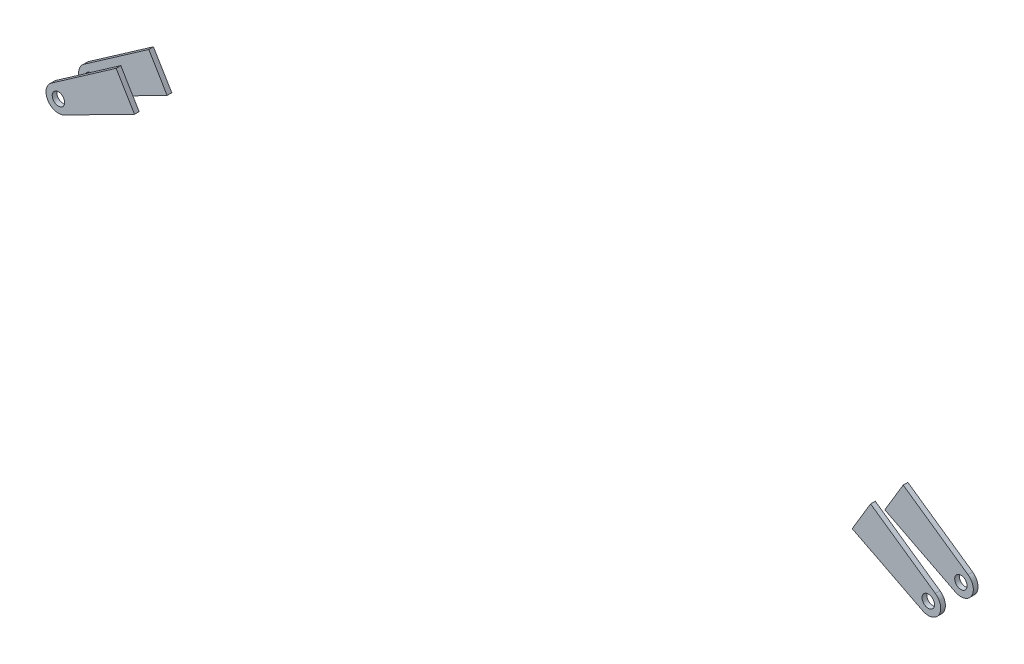
ISO-10303-21;
HEADER;
FILE_DESCRIPTION(('STEP AP214'),'2;1');
FILE_NAME('part.step','',(''),(''),'','','');
FILE_SCHEMA(('AUTOMOTIVE_DESIGN { 1 0 10303 214 1 1 1 1 }'));
ENDSEC;
DATA;
#1=APPLICATION_CONTEXT('core data for automotive mechanical design processes');
#2=APPLICATION_PROTOCOL_DEFINITION('international standard','automotive_design',2000,#1);
#3=PRODUCT_CONTEXT('',#1,'mechanical');
#4=PRODUCT('Part','Part','',(#3));
#5=PRODUCT_RELATED_PRODUCT_CATEGORY('part','',(#4));
#6=PRODUCT_DEFINITION_FORMATION('','',#4);
#7=PRODUCT_DEFINITION_CONTEXT('part definition',#1,'design');
#8=PRODUCT_DEFINITION('design','',#6,#7);
#9=PRODUCT_DEFINITION_SHAPE('','',#8);
#10=(LENGTH_UNIT() NAMED_UNIT(*) SI_UNIT(.MILLI.,.METRE.));
#11=(NAMED_UNIT(*) PLANE_ANGLE_UNIT() SI_UNIT($,.RADIAN.));
#12=(NAMED_UNIT(*) SI_UNIT($,.STERADIAN.) SOLID_ANGLE_UNIT());
#13=UNCERTAINTY_MEASURE_WITH_UNIT(LENGTH_MEASURE(1.E-05),#10,'distance_accuracy_value','');
#14=(GEOMETRIC_REPRESENTATION_CONTEXT(3) GLOBAL_UNCERTAINTY_ASSIGNED_CONTEXT((#13)) GLOBAL_UNIT_ASSIGNED_CONTEXT((#10,
#11,#12)) REPRESENTATION_CONTEXT('',''));
#15=CARTESIAN_POINT('',(0.,0.,0.));
#16=DIRECTION('',(0.,0.,1.));
#17=DIRECTION('',(1.,0.,0.));
#18=AXIS2_PLACEMENT_3D('',#15,#16,#17);
#19=CARTESIAN_POINT('',(0.,0.,284.999999999997));
#20=DIRECTION('',(0.,0.,1.));
#21=DIRECTION('',(1.,0.,0.));
#22=AXIS2_PLACEMENT_3D('',#19,#20,#21);
#23=PLANE('',#22);
#24=CARTESIAN_POINT('',(-280.,-1980.,284.999999999998));
#25=DIRECTION('',(0.,0.,-1.));
#26=DIRECTION('',(-1.,0.,0.));
#27=AXIS2_PLACEMENT_3D('',#24,#25,#26);
#28=CIRCLE('',#27,3.99999999999999);
#29=CARTESIAN_POINT('',(-284.,-1980.,284.999999999998));
#30=VERTEX_POINT('',#29);
#31=EDGE_CURVE('E145',#30,#30,#28,.T.);
#32=ORIENTED_EDGE('',*,*,#31,.F.);
#33=EDGE_LOOP('',(#32));
#34=FACE_BOUND('',#33,.T.);
#35=DIRECTION('',(-0.514013807328671,0.857781910438478,0.));
#36=VECTOR('',#35,1.);
#37=CARTESIAN_POINT('',(-231.021017412709,-1964.05670118202,284.999999999998));
#38=LINE('',#37,#36);
#39=CARTESIAN_POINT('',(-231.021017412709,-1964.05670118202,284.999999999998));
#40=VERTEX_POINT('',#39);
#41=CARTESIAN_POINT('',(-242.843334981269,-1944.32771724194,284.999999999998));
#42=VERTEX_POINT('',#41);
#43=EDGE_CURVE('E131',#40,#42,#38,.T.);
#44=ORIENTED_EDGE('',*,*,#43,.F.);
#45=DIRECTION('',(0.891277696305126,0.453457901098909,0.));
#46=VECTOR('',#45,1.);
#47=CARTESIAN_POINT('',(-276.372336791209,-1987.13022157044,284.999999999998));
#48=LINE('',#47,#46);
#49=CARTESIAN_POINT('',(-276.372336791209,-1987.13022157044,284.999999999998));
#50=VERTEX_POINT('',#49);
#51=EDGE_CURVE('E138',#50,#40,#48,.T.);
#52=ORIENTED_EDGE('',*,*,#51,.F.);
#53=CARTESIAN_POINT('',(-280.,-1980.,284.999999999998));
#54=DIRECTION('',(0.,0.,1.));
#55=DIRECTION('',(-1.,0.,0.));
#56=AXIS2_PLACEMENT_3D('',#53,#54,#55);
#57=CIRCLE('',#56,8.00000000000005);
#58=CARTESIAN_POINT('',(-284.576864871312,-1973.43857424413,284.999999999998));
#59=VERTEX_POINT('',#58);
#60=EDGE_CURVE('E160',#59,#50,#57,.T.);
#61=ORIENTED_EDGE('',*,*,#60,.F.);
#62=DIRECTION('',(-0.820178219483358,-0.572108108913961,0.));
#63=VECTOR('',#62,1.);
#64=CARTESIAN_POINT('',(-242.843334981269,-1944.32771724194,284.999999999998));
#65=LINE('',#64,#63);
#66=EDGE_CURVE('E95',#42,#59,#65,.T.);
#67=ORIENTED_EDGE('',*,*,#66,.F.);
#68=EDGE_LOOP('',(#44,#52,#61,#67));
#69=FACE_BOUND('',#68,.T.);
#70=ADVANCED_FACE('F86',(#34,#69),#23,.F.);
#71=CARTESIAN_POINT('',(0.,0.,287.999999999997));
#72=DIRECTION('',(0.,0.,1.));
#73=DIRECTION('',(1.,0.,0.));
#74=AXIS2_PLACEMENT_3D('',#71,#72,#73);
#75=PLANE('',#74);
#76=CARTESIAN_POINT('',(-280.,-1980.,287.999999999998));
#77=DIRECTION('',(0.,0.,-1.));
#78=DIRECTION('',(-1.,0.,0.));
#79=AXIS2_PLACEMENT_3D('',#76,#77,#78);
#80=CIRCLE('',#79,3.99999999999999);
#81=CARTESIAN_POINT('',(-284.,-1980.,287.999999999998));
#82=VERTEX_POINT('',#81);
#83=EDGE_CURVE('E148',#82,#82,#80,.T.);
#84=ORIENTED_EDGE('',*,*,#83,.T.);
#85=EDGE_LOOP('',(#84));
#86=FACE_BOUND('',#85,.T.);
#87=DIRECTION('',(-0.514013807328671,0.857781910438478,0.));
#88=VECTOR('',#87,1.);
#89=CARTESIAN_POINT('',(-231.021017412709,-1964.05670118202,287.999999999998));
#90=LINE('',#89,#88);
#91=CARTESIAN_POINT('',(-231.021017412709,-1964.05670118202,287.999999999998));
#92=VERTEX_POINT('',#91);
#93=CARTESIAN_POINT('',(-242.843334981269,-1944.32771724194,287.999999999998));
#94=VERTEX_POINT('',#93);
#95=EDGE_CURVE('E133',#92,#94,#90,.T.);
#96=ORIENTED_EDGE('',*,*,#95,.T.);
#97=DIRECTION('',(-0.820178219483358,-0.572108108913961,0.));
#98=VECTOR('',#97,1.);
#99=CARTESIAN_POINT('',(-242.843334981269,-1944.32771724194,287.999999999998));
#100=LINE('',#99,#98);
#101=CARTESIAN_POINT('',(-284.576864871312,-1973.43857424413,287.999999999998));
#102=VERTEX_POINT('',#101);
#103=EDGE_CURVE('E13',#94,#102,#100,.T.);
#104=ORIENTED_EDGE('',*,*,#103,.T.);
#105=CARTESIAN_POINT('',(-280.,-1980.,287.999999999998));
#106=DIRECTION('',(0.,0.,1.));
#107=DIRECTION('',(-1.,0.,0.));
#108=AXIS2_PLACEMENT_3D('',#105,#106,#107);
#109=CIRCLE('',#108,8.00000000000005);
#110=CARTESIAN_POINT('',(-276.372336791209,-1987.13022157044,287.999999999998));
#111=VERTEX_POINT('',#110);
#112=EDGE_CURVE('E157',#102,#111,#109,.T.);
#113=ORIENTED_EDGE('',*,*,#112,.T.);
#114=DIRECTION('',(0.891277696305126,0.453457901098909,0.));
#115=VECTOR('',#114,1.);
#116=CARTESIAN_POINT('',(-276.372336791209,-1987.13022157044,287.999999999998));
#117=LINE('',#116,#115);
#118=EDGE_CURVE('E162',#111,#92,#117,.T.);
#119=ORIENTED_EDGE('',*,*,#118,.T.);
#120=EDGE_LOOP('',(#96,#104,#113,#119));
#121=FACE_BOUND('',#120,.T.);
#122=ADVANCED_FACE('F174',(#86,#121),#75,.T.);
#123=CARTESIAN_POINT('',(-231.021017412709,-1964.05670118202,287.999999999998));
#124=DIRECTION('',(-0.857781910438478,-0.514013807328671,0.));
#125=DIRECTION('',(-0.514013807328671,0.857781910438478,0.));
#126=AXIS2_PLACEMENT_3D('',#123,#124,#125);
#127=PLANE('',#126);
#128=ORIENTED_EDGE('',*,*,#43,.T.);
#129=DIRECTION('',(0.,0.,-1.));
#130=VECTOR('',#129,1.);
#131=CARTESIAN_POINT('',(-242.843334981269,-1944.32771724194,287.999999999998));
#132=LINE('',#131,#130);
#133=EDGE_CURVE('E121',#94,#42,#132,.T.);
#134=ORIENTED_EDGE('',*,*,#133,.F.);
#135=ORIENTED_EDGE('',*,*,#95,.F.);
#136=DIRECTION('',(0.,0.,-1.));
#137=VECTOR('',#136,1.);
#138=CARTESIAN_POINT('',(-231.021017412709,-1964.05670118202,287.999999999998));
#139=LINE('',#138,#137);
#140=EDGE_CURVE('E127',#92,#40,#139,.T.);
#141=ORIENTED_EDGE('',*,*,#140,.T.);
#142=EDGE_LOOP('',(#128,#134,#135,#141));
#143=FACE_BOUND('',#142,.T.);
#144=ADVANCED_FACE('F129',(#143),#127,.F.);
#145=CARTESIAN_POINT('',(-276.372336791209,-1987.13022157044,287.999999999998));
#146=DIRECTION('',(-0.453457901098909,0.891277696305126,0.));
#147=DIRECTION('',(0.891277696305126,0.453457901098909,0.));
#148=AXIS2_PLACEMENT_3D('',#145,#146,#147);
#149=PLANE('',#148);
#150=ORIENTED_EDGE('',*,*,#51,.T.);
#151=ORIENTED_EDGE('',*,*,#140,.F.);
#152=ORIENTED_EDGE('',*,*,#118,.F.);
#153=DIRECTION('',(0.,0.,-1.));
#154=VECTOR('',#153,1.);
#155=CARTESIAN_POINT('',(-276.372336791209,-1987.13022157044,287.999999999998));
#156=LINE('',#155,#154);
#157=EDGE_CURVE('E140',#111,#50,#156,.T.);
#158=ORIENTED_EDGE('',*,*,#157,.T.);
#159=EDGE_LOOP('',(#150,#151,#152,#158));
#160=FACE_BOUND('',#159,.T.);
#161=ADVANCED_FACE('F139',(#160),#149,.F.);
#162=CARTESIAN_POINT('',(-280.,-1980.,287.999999999998));
#163=DIRECTION('',(0.,0.,-1.));
#164=DIRECTION('',(-1.,0.,0.));
#165=AXIS2_PLACEMENT_3D('',#162,#163,#164);
#166=CYLINDRICAL_SURFACE('',#165,8.00000000000005);
#167=ORIENTED_EDGE('',*,*,#60,.T.);
#168=ORIENTED_EDGE('',*,*,#157,.F.);
#169=ORIENTED_EDGE('',*,*,#112,.F.);
#170=DIRECTION('',(0.,0.,-1.));
#171=VECTOR('',#170,1.);
#172=CARTESIAN_POINT('',(-284.576864871312,-1973.43857424413,287.999999999998));
#173=LINE('',#172,#171);
#174=EDGE_CURVE('E104',#102,#59,#173,.T.);
#175=ORIENTED_EDGE('',*,*,#174,.T.);
#176=EDGE_LOOP('',(#167,#168,#169,#175));
#177=FACE_BOUND('',#176,.T.);
#178=ADVANCED_FACE('F210',(#177),#166,.T.);
#179=CARTESIAN_POINT('',(-242.843334981269,-1944.32771724194,287.999999999998));
#180=DIRECTION('',(0.572108108913961,-0.820178219483358,0.));
#181=DIRECTION('',(-0.820178219483358,-0.572108108913961,0.));
#182=AXIS2_PLACEMENT_3D('',#179,#180,#181);
#183=PLANE('',#182);
#184=ORIENTED_EDGE('',*,*,#66,.T.);
#185=ORIENTED_EDGE('',*,*,#174,.F.);
#186=ORIENTED_EDGE('',*,*,#103,.F.);
#187=ORIENTED_EDGE('',*,*,#133,.T.);
#188=EDGE_LOOP('',(#184,#185,#186,#187));
#189=FACE_BOUND('',#188,.T.);
#190=ADVANCED_FACE('F195',(#189),#183,.F.);
#191=CARTESIAN_POINT('',(-280.,-1980.,287.999999999998));
#192=DIRECTION('',(0.,0.,-1.));
#193=DIRECTION('',(-1.,0.,0.));
#194=AXIS2_PLACEMENT_3D('',#191,#192,#193);
#195=CYLINDRICAL_SURFACE('',#194,3.99999999999999);
#196=ORIENTED_EDGE('',*,*,#83,.F.);
#197=EDGE_LOOP('',(#196));
#198=FACE_BOUND('',#197,.T.);
#199=ORIENTED_EDGE('',*,*,#31,.T.);
#200=EDGE_LOOP('',(#199));
#201=FACE_BOUND('',#200,.T.);
#202=ADVANCED_FACE('F192',(#198,#201),#195,.F.);
#203=CLOSED_SHELL('',(#70,#122,#144,#161,#178,#190,#202));
#204=MANIFOLD_SOLID_BREP('B2',#203);
#205=CARTESIAN_POINT('',(0.,0.,308.999999999999));
#206=DIRECTION('',(0.,0.,-1.));
#207=DIRECTION('',(1.,0.,0.));
#208=AXIS2_PLACEMENT_3D('',#205,#206,#207);
#209=PLANE('',#208);
#210=CARTESIAN_POINT('',(-280.,-1980.,308.999999999998));
#211=DIRECTION('',(0.,0.,-1.));
#212=DIRECTION('',(-1.,0.,0.));
#213=AXIS2_PLACEMENT_3D('',#210,#211,#212);
#214=CIRCLE('',#213,3.99999999999999);
#215=CARTESIAN_POINT('',(-284.,-1980.,308.999999999998));
#216=VERTEX_POINT('',#215);
#217=EDGE_CURVE('E325',#216,#216,#214,.T.);
#218=ORIENTED_EDGE('',*,*,#217,.T.);
#219=EDGE_LOOP('',(#218));
#220=FACE_BOUND('',#219,.T.);
#221=DIRECTION('',(-0.514013807328671,0.857781910438478,0.));
#222=VECTOR('',#221,1.);
#223=CARTESIAN_POINT('',(-231.021017412709,-1964.05670118202,308.999999999998));
#224=LINE('',#223,#222);
#225=CARTESIAN_POINT('',(-231.021017412709,-1964.05670118202,308.999999999998));
#226=VERTEX_POINT('',#225);
#227=CARTESIAN_POINT('',(-242.843334981269,-1944.32771724194,308.999999999998));
#228=VERTEX_POINT('',#227);
#229=EDGE_CURVE('E317',#226,#228,#224,.T.);
#230=ORIENTED_EDGE('',*,*,#229,.T.);
#231=DIRECTION('',(-0.820178219483358,-0.572108108913961,0.));
#232=VECTOR('',#231,1.);
#233=CARTESIAN_POINT('',(-242.843334981269,-1944.32771724194,308.999999999998));
#234=LINE('',#233,#232);
#235=CARTESIAN_POINT('',(-284.576864871312,-1973.43857424413,308.999999999998));
#236=VERTEX_POINT('',#235);
#237=EDGE_CURVE('E274',#228,#236,#234,.T.);
#238=ORIENTED_EDGE('',*,*,#237,.T.);
#239=CARTESIAN_POINT('',(-280.,-1980.,308.999999999998));
#240=DIRECTION('',(0.,0.,1.));
#241=DIRECTION('',(-1.,0.,0.));
#242=AXIS2_PLACEMENT_3D('',#239,#240,#241);
#243=CIRCLE('',#242,8.00000000000005);
#244=CARTESIAN_POINT('',(-276.372336791209,-1987.13022157044,308.999999999998));
#245=VERTEX_POINT('',#244);
#246=EDGE_CURVE('E321',#236,#245,#243,.T.);
#247=ORIENTED_EDGE('',*,*,#246,.T.);
#248=DIRECTION('',(0.891277696305126,0.453457901098909,0.));
#249=VECTOR('',#248,1.);
#250=CARTESIAN_POINT('',(-276.372336791209,-1987.13022157044,308.999999999998));
#251=LINE('',#250,#249);
#252=EDGE_CURVE('E311',#245,#226,#251,.T.);
#253=ORIENTED_EDGE('',*,*,#252,.T.);
#254=EDGE_LOOP('',(#230,#238,#247,#253));
#255=FACE_BOUND('',#254,.T.);
#256=ADVANCED_FACE('F265',(#220,#255),#209,.F.);
#257=CARTESIAN_POINT('',(0.,0.,305.999999999999));
#258=DIRECTION('',(0.,0.,-1.));
#259=DIRECTION('',(1.,0.,0.));
#260=AXIS2_PLACEMENT_3D('',#257,#258,#259);
#261=PLANE('',#260);
#262=CARTESIAN_POINT('',(-280.,-1980.,305.999999999998));
#263=DIRECTION('',(0.,0.,-1.));
#264=DIRECTION('',(-1.,0.,0.));
#265=AXIS2_PLACEMENT_3D('',#262,#263,#264);
#266=CIRCLE('',#265,3.99999999999999);
#267=CARTESIAN_POINT('',(-284.,-1980.,305.999999999998));
#268=VERTEX_POINT('',#267);
#269=EDGE_CURVE('E328',#268,#268,#266,.T.);
#270=ORIENTED_EDGE('',*,*,#269,.F.);
#271=EDGE_LOOP('',(#270));
#272=FACE_BOUND('',#271,.T.);
#273=DIRECTION('',(-0.514013807328671,0.857781910438478,0.));
#274=VECTOR('',#273,1.);
#275=CARTESIAN_POINT('',(-231.021017412709,-1964.05670118202,305.999999999998));
#276=LINE('',#275,#274);
#277=CARTESIAN_POINT('',(-231.021017412709,-1964.05670118202,305.999999999998));
#278=VERTEX_POINT('',#277);
#279=CARTESIAN_POINT('',(-242.843334981269,-1944.32771724194,305.999999999998));
#280=VERTEX_POINT('',#279);
#281=EDGE_CURVE('E316',#278,#280,#276,.T.);
#282=ORIENTED_EDGE('',*,*,#281,.F.);
#283=DIRECTION('',(0.891277696305126,0.453457901098909,0.));
#284=VECTOR('',#283,1.);
#285=CARTESIAN_POINT('',(-276.372336791209,-1987.13022157044,305.999999999998));
#286=LINE('',#285,#284);
#287=CARTESIAN_POINT('',(-276.372336791209,-1987.13022157044,305.999999999998));
#288=VERTEX_POINT('',#287);
#289=EDGE_CURVE('E314',#288,#278,#286,.T.);
#290=ORIENTED_EDGE('',*,*,#289,.F.);
#291=CARTESIAN_POINT('',(-280.,-1980.,305.999999999998));
#292=DIRECTION('',(0.,0.,1.));
#293=DIRECTION('',(-1.,0.,0.));
#294=AXIS2_PLACEMENT_3D('',#291,#292,#293);
#295=CIRCLE('',#294,8.00000000000005);
#296=CARTESIAN_POINT('',(-284.576864871312,-1973.43857424413,305.999999999998));
#297=VERTEX_POINT('',#296);
#298=EDGE_CURVE('E337',#297,#288,#295,.T.);
#299=ORIENTED_EDGE('',*,*,#298,.F.);
#300=DIRECTION('',(-0.820178219483358,-0.572108108913961,0.));
#301=VECTOR('',#300,1.);
#302=CARTESIAN_POINT('',(-242.843334981269,-1944.32771724194,305.999999999998));
#303=LINE('',#302,#301);
#304=EDGE_CURVE('E84',#280,#297,#303,.T.);
#305=ORIENTED_EDGE('',*,*,#304,.F.);
#306=EDGE_LOOP('',(#282,#290,#299,#305));
#307=FACE_BOUND('',#306,.T.);
#308=ADVANCED_FACE('F354',(#272,#307),#261,.T.);
#309=CARTESIAN_POINT('',(-231.021017412709,-1964.05670118202,305.999999999998));
#310=DIRECTION('',(-0.857781910438478,-0.514013807328671,0.));
#311=DIRECTION('',(-0.514013807328671,0.857781910438478,0.));
#312=AXIS2_PLACEMENT_3D('',#309,#310,#311);
#313=PLANE('',#312);
#314=ORIENTED_EDGE('',*,*,#229,.F.);
#315=DIRECTION('',(0.,0.,1.));
#316=VECTOR('',#315,1.);
#317=CARTESIAN_POINT('',(-231.021017412709,-1964.05670118202,305.999999999998));
#318=LINE('',#317,#316);
#319=EDGE_CURVE('E308',#278,#226,#318,.T.);
#320=ORIENTED_EDGE('',*,*,#319,.F.);
#321=ORIENTED_EDGE('',*,*,#281,.T.);
#322=DIRECTION('',(0.,0.,1.));
#323=VECTOR('',#322,1.);
#324=CARTESIAN_POINT('',(-242.843334981269,-1944.32771724194,305.999999999998));
#325=LINE('',#324,#323);
#326=EDGE_CURVE('E302',#280,#228,#325,.T.);
#327=ORIENTED_EDGE('',*,*,#326,.T.);
#328=EDGE_LOOP('',(#314,#320,#321,#327));
#329=FACE_BOUND('',#328,.T.);
#330=ADVANCED_FACE('F324',(#329),#313,.F.);
#331=CARTESIAN_POINT('',(-276.372336791209,-1987.13022157044,305.999999999998));
#332=DIRECTION('',(-0.453457901098909,0.891277696305126,0.));
#333=DIRECTION('',(0.891277696305126,0.453457901098909,0.));
#334=AXIS2_PLACEMENT_3D('',#331,#332,#333);
#335=PLANE('',#334);
#336=ORIENTED_EDGE('',*,*,#252,.F.);
#337=DIRECTION('',(0.,0.,1.));
#338=VECTOR('',#337,1.);
#339=CARTESIAN_POINT('',(-276.372336791209,-1987.13022157044,305.999999999998));
#340=LINE('',#339,#338);
#341=EDGE_CURVE('E322',#288,#245,#340,.T.);
#342=ORIENTED_EDGE('',*,*,#341,.F.);
#343=ORIENTED_EDGE('',*,*,#289,.T.);
#344=ORIENTED_EDGE('',*,*,#319,.T.);
#345=EDGE_LOOP('',(#336,#342,#343,#344));
#346=FACE_BOUND('',#345,.T.);
#347=ADVANCED_FACE('F310',(#346),#335,.F.);
#348=CARTESIAN_POINT('',(-280.,-1980.,305.999999999998));
#349=DIRECTION('',(0.,0.,1.));
#350=DIRECTION('',(-1.,0.,0.));
#351=AXIS2_PLACEMENT_3D('',#348,#349,#350);
#352=CYLINDRICAL_SURFACE('',#351,8.00000000000005);
#353=ORIENTED_EDGE('',*,*,#246,.F.);
#354=DIRECTION('',(0.,0.,1.));
#355=VECTOR('',#354,1.);
#356=CARTESIAN_POINT('',(-284.576864871312,-1973.43857424413,305.999999999998));
#357=LINE('',#356,#355);
#358=EDGE_CURVE('E283',#297,#236,#357,.T.);
#359=ORIENTED_EDGE('',*,*,#358,.F.);
#360=ORIENTED_EDGE('',*,*,#298,.T.);
#361=ORIENTED_EDGE('',*,*,#341,.T.);
#362=EDGE_LOOP('',(#353,#359,#360,#361));
#363=FACE_BOUND('',#362,.T.);
#364=ADVANCED_FACE('F350',(#363),#352,.T.);
#365=CARTESIAN_POINT('',(-242.843334981269,-1944.32771724194,305.999999999998));
#366=DIRECTION('',(0.572108108913961,-0.820178219483358,0.));
#367=DIRECTION('',(-0.820178219483358,-0.572108108913961,0.));
#368=AXIS2_PLACEMENT_3D('',#365,#366,#367);
#369=PLANE('',#368);
#370=ORIENTED_EDGE('',*,*,#237,.F.);
#371=ORIENTED_EDGE('',*,*,#326,.F.);
#372=ORIENTED_EDGE('',*,*,#304,.T.);
#373=ORIENTED_EDGE('',*,*,#358,.T.);
#374=EDGE_LOOP('',(#370,#371,#372,#373));
#375=FACE_BOUND('',#374,.T.);
#376=ADVANCED_FACE('F367',(#375),#369,.F.);
#377=CARTESIAN_POINT('',(-280.,-1980.,305.999999999998));
#378=DIRECTION('',(0.,0.,1.));
#379=DIRECTION('',(-1.,0.,0.));
#380=AXIS2_PLACEMENT_3D('',#377,#378,#379);
#381=CYLINDRICAL_SURFACE('',#380,3.99999999999999);
#382=ORIENTED_EDGE('',*,*,#269,.T.);
#383=EDGE_LOOP('',(#382));
#384=FACE_BOUND('',#383,.T.);
#385=ORIENTED_EDGE('',*,*,#217,.F.);
#386=EDGE_LOOP('',(#385));
#387=FACE_BOUND('',#386,.T.);
#388=ADVANCED_FACE('F369',(#384,#387),#381,.F.);
#389=CLOSED_SHELL('',(#256,#308,#330,#347,#364,#376,#388));
#390=MANIFOLD_SOLID_BREP('B7',#389);
#391=CARTESIAN_POINT('',(0.,0.,284.999999999997));
#392=DIRECTION('',(0.,0.,1.));
#393=DIRECTION('',(-1.,0.,0.));
#394=AXIS2_PLACEMENT_3D('',#391,#392,#393);
#395=PLANE('',#394);
#396=CARTESIAN_POINT('',(280.,-1980.,284.999999999998));
#397=DIRECTION('',(0.,0.,1.));
#398=DIRECTION('',(1.,0.,0.));
#399=AXIS2_PLACEMENT_3D('',#396,#397,#398);
#400=CIRCLE('',#399,3.99999999999999);
#401=CARTESIAN_POINT('',(284.,-1980.,284.999999999998));
#402=VERTEX_POINT('',#401);
#403=EDGE_CURVE('E503',#402,#402,#400,.T.);
#404=ORIENTED_EDGE('',*,*,#403,.T.);
#405=EDGE_LOOP('',(#404));
#406=FACE_BOUND('',#405,.T.);
#407=DIRECTION('',(0.514013807328671,0.857781910438478,0.));
#408=VECTOR('',#407,1.);
#409=CARTESIAN_POINT('',(231.021017412709,-1964.05670118202,284.999999999998));
#410=LINE('',#409,#408);
#411=CARTESIAN_POINT('',(231.021017412709,-1964.05670118202,284.999999999998));
#412=VERTEX_POINT('',#411);
#413=CARTESIAN_POINT('',(242.843334981269,-1944.32771724194,284.999999999998));
#414=VERTEX_POINT('',#413);
#415=EDGE_CURVE('E495',#412,#414,#410,.T.);
#416=ORIENTED_EDGE('',*,*,#415,.T.);
#417=DIRECTION('',(0.820178219483358,-0.572108108913961,0.));
#418=VECTOR('',#417,1.);
#419=CARTESIAN_POINT('',(242.843334981269,-1944.32771724194,284.999999999998));
#420=LINE('',#419,#418);
#421=CARTESIAN_POINT('',(284.576864871312,-1973.43857424413,284.999999999998));
#422=VERTEX_POINT('',#421);
#423=EDGE_CURVE('E452',#414,#422,#420,.T.);
#424=ORIENTED_EDGE('',*,*,#423,.T.);
#425=CARTESIAN_POINT('',(280.,-1980.,284.999999999998));
#426=DIRECTION('',(0.,0.,-1.));
#427=DIRECTION('',(1.,0.,0.));
#428=AXIS2_PLACEMENT_3D('',#425,#426,#427);
#429=CIRCLE('',#428,8.00000000000005);
#430=CARTESIAN_POINT('',(276.372336791209,-1987.13022157044,284.999999999998));
#431=VERTEX_POINT('',#430);
#432=EDGE_CURVE('E499',#422,#431,#429,.T.);
#433=ORIENTED_EDGE('',*,*,#432,.T.);
#434=DIRECTION('',(-0.891277696305126,0.453457901098909,0.));
#435=VECTOR('',#434,1.);
#436=CARTESIAN_POINT('',(276.372336791209,-1987.13022157044,284.999999999998));
#437=LINE('',#436,#435);
#438=EDGE_CURVE('E489',#431,#412,#437,.T.);
#439=ORIENTED_EDGE('',*,*,#438,.T.);
#440=EDGE_LOOP('',(#416,#424,#433,#439));
#441=FACE_BOUND('',#440,.T.);
#442=ADVANCED_FACE('F443',(#406,#441),#395,.F.);
#443=CARTESIAN_POINT('',(0.,0.,287.999999999997));
#444=DIRECTION('',(0.,0.,1.));
#445=DIRECTION('',(-1.,0.,0.));
#446=AXIS2_PLACEMENT_3D('',#443,#444,#445);
#447=PLANE('',#446);
#448=CARTESIAN_POINT('',(280.,-1980.,287.999999999998));
#449=DIRECTION('',(0.,0.,1.));
#450=DIRECTION('',(1.,0.,0.));
#451=AXIS2_PLACEMENT_3D('',#448,#449,#450);
#452=CIRCLE('',#451,3.99999999999999);
#453=CARTESIAN_POINT('',(284.,-1980.,287.999999999998));
#454=VERTEX_POINT('',#453);
#455=EDGE_CURVE('E506',#454,#454,#452,.T.);
#456=ORIENTED_EDGE('',*,*,#455,.F.);
#457=EDGE_LOOP('',(#456));
#458=FACE_BOUND('',#457,.T.);
#459=DIRECTION('',(0.514013807328671,0.857781910438478,0.));
#460=VECTOR('',#459,1.);
#461=CARTESIAN_POINT('',(231.021017412709,-1964.05670118202,287.999999999998));
#462=LINE('',#461,#460);
#463=CARTESIAN_POINT('',(231.021017412709,-1964.05670118202,287.999999999998));
#464=VERTEX_POINT('',#463);
#465=CARTESIAN_POINT('',(242.843334981269,-1944.32771724194,287.999999999998));
#466=VERTEX_POINT('',#465);
#467=EDGE_CURVE('E494',#464,#466,#462,.T.);
#468=ORIENTED_EDGE('',*,*,#467,.F.);
#469=DIRECTION('',(-0.891277696305126,0.453457901098909,0.));
#470=VECTOR('',#469,1.);
#471=CARTESIAN_POINT('',(276.372336791209,-1987.13022157044,287.999999999998));
#472=LINE('',#471,#470);
#473=CARTESIAN_POINT('',(276.372336791209,-1987.13022157044,287.999999999998));
#474=VERTEX_POINT('',#473);
#475=EDGE_CURVE('E492',#474,#464,#472,.T.);
#476=ORIENTED_EDGE('',*,*,#475,.F.);
#477=CARTESIAN_POINT('',(280.,-1980.,287.999999999998));
#478=DIRECTION('',(0.,0.,-1.));
#479=DIRECTION('',(1.,0.,0.));
#480=AXIS2_PLACEMENT_3D('',#477,#478,#479);
#481=CIRCLE('',#480,8.00000000000005);
#482=CARTESIAN_POINT('',(284.576864871312,-1973.43857424413,287.999999999998));
#483=VERTEX_POINT('',#482);
#484=EDGE_CURVE('E515',#483,#474,#481,.T.);
#485=ORIENTED_EDGE('',*,*,#484,.F.);
#486=DIRECTION('',(0.820178219483358,-0.572108108913961,0.));
#487=VECTOR('',#486,1.);
#488=CARTESIAN_POINT('',(242.843334981269,-1944.32771724194,287.999999999998));
#489=LINE('',#488,#487);
#490=EDGE_CURVE('E263',#466,#483,#489,.T.);
#491=ORIENTED_EDGE('',*,*,#490,.F.);
#492=EDGE_LOOP('',(#468,#476,#485,#491));
#493=FACE_BOUND('',#492,.T.);
#494=ADVANCED_FACE('F532',(#458,#493),#447,.T.);
#495=CARTESIAN_POINT('',(231.021017412709,-1964.05670118202,287.999999999998));
#496=DIRECTION('',(0.857781910438478,-0.514013807328671,0.));
#497=DIRECTION('',(0.514013807328671,0.857781910438478,0.));
#498=AXIS2_PLACEMENT_3D('',#495,#496,#497);
#499=PLANE('',#498);
#500=ORIENTED_EDGE('',*,*,#415,.F.);
#501=DIRECTION('',(0.,0.,-1.));
#502=VECTOR('',#501,1.);
#503=CARTESIAN_POINT('',(231.021017412709,-1964.05670118202,287.999999999998));
#504=LINE('',#503,#502);
#505=EDGE_CURVE('E486',#464,#412,#504,.T.);
#506=ORIENTED_EDGE('',*,*,#505,.F.);
#507=ORIENTED_EDGE('',*,*,#467,.T.);
#508=DIRECTION('',(0.,0.,-1.));
#509=VECTOR('',#508,1.);
#510=CARTESIAN_POINT('',(242.843334981269,-1944.32771724194,287.999999999998));
#511=LINE('',#510,#509);
#512=EDGE_CURVE('E480',#466,#414,#511,.T.);
#513=ORIENTED_EDGE('',*,*,#512,.T.);
#514=EDGE_LOOP('',(#500,#506,#507,#513));
#515=FACE_BOUND('',#514,.T.);
#516=ADVANCED_FACE('F502',(#515),#499,.F.);
#517=CARTESIAN_POINT('',(276.372336791209,-1987.13022157044,287.999999999998));
#518=DIRECTION('',(0.453457901098909,0.891277696305126,0.));
#519=DIRECTION('',(-0.891277696305126,0.453457901098909,0.));
#520=AXIS2_PLACEMENT_3D('',#517,#518,#519);
#521=PLANE('',#520);
#522=ORIENTED_EDGE('',*,*,#438,.F.);
#523=DIRECTION('',(0.,0.,-1.));
#524=VECTOR('',#523,1.);
#525=CARTESIAN_POINT('',(276.372336791209,-1987.13022157044,287.999999999998));
#526=LINE('',#525,#524);
#527=EDGE_CURVE('E500',#474,#431,#526,.T.);
#528=ORIENTED_EDGE('',*,*,#527,.F.);
#529=ORIENTED_EDGE('',*,*,#475,.T.);
#530=ORIENTED_EDGE('',*,*,#505,.T.);
#531=EDGE_LOOP('',(#522,#528,#529,#530));
#532=FACE_BOUND('',#531,.T.);
#533=ADVANCED_FACE('F488',(#532),#521,.F.);
#534=CARTESIAN_POINT('',(280.,-1980.,287.999999999998));
#535=DIRECTION('',(0.,0.,-1.));
#536=DIRECTION('',(1.,0.,0.));
#537=AXIS2_PLACEMENT_3D('',#534,#535,#536);
#538=CYLINDRICAL_SURFACE('',#537,8.00000000000005);
#539=ORIENTED_EDGE('',*,*,#432,.F.);
#540=DIRECTION('',(0.,0.,-1.));
#541=VECTOR('',#540,1.);
#542=CARTESIAN_POINT('',(284.576864871312,-1973.43857424413,287.999999999998));
#543=LINE('',#542,#541);
#544=EDGE_CURVE('E461',#483,#422,#543,.T.);
#545=ORIENTED_EDGE('',*,*,#544,.F.);
#546=ORIENTED_EDGE('',*,*,#484,.T.);
#547=ORIENTED_EDGE('',*,*,#527,.T.);
#548=EDGE_LOOP('',(#539,#545,#546,#547));
#549=FACE_BOUND('',#548,.T.);
#550=ADVANCED_FACE('F528',(#549),#538,.T.);
#551=CARTESIAN_POINT('',(242.843334981269,-1944.32771724194,287.999999999998));
#552=DIRECTION('',(-0.572108108913961,-0.820178219483358,0.));
#553=DIRECTION('',(0.820178219483358,-0.572108108913961,0.));
#554=AXIS2_PLACEMENT_3D('',#551,#552,#553);
#555=PLANE('',#554);
#556=ORIENTED_EDGE('',*,*,#423,.F.);
#557=ORIENTED_EDGE('',*,*,#512,.F.);
#558=ORIENTED_EDGE('',*,*,#490,.T.);
#559=ORIENTED_EDGE('',*,*,#544,.T.);
#560=EDGE_LOOP('',(#556,#557,#558,#559));
#561=FACE_BOUND('',#560,.T.);
#562=ADVANCED_FACE('F545',(#561),#555,.F.);
#563=CARTESIAN_POINT('',(280.,-1980.,287.999999999998));
#564=DIRECTION('',(0.,0.,-1.));
#565=DIRECTION('',(1.,0.,0.));
#566=AXIS2_PLACEMENT_3D('',#563,#564,#565);
#567=CYLINDRICAL_SURFACE('',#566,3.99999999999999);
#568=ORIENTED_EDGE('',*,*,#455,.T.);
#569=EDGE_LOOP('',(#568));
#570=FACE_BOUND('',#569,.T.);
#571=ORIENTED_EDGE('',*,*,#403,.F.);
#572=EDGE_LOOP('',(#571));
#573=FACE_BOUND('',#572,.T.);
#574=ADVANCED_FACE('F547',(#570,#573),#567,.F.);
#575=CLOSED_SHELL('',(#442,#494,#516,#533,#550,#562,#574));
#576=MANIFOLD_SOLID_BREP('B78',#575);
#577=CARTESIAN_POINT('',(0.,0.,308.999999999999));
#578=DIRECTION('',(0.,0.,-1.));
#579=DIRECTION('',(-1.,0.,0.));
#580=AXIS2_PLACEMENT_3D('',#577,#578,#579);
#581=PLANE('',#580);
#582=CARTESIAN_POINT('',(280.,-1980.,308.999999999998));
#583=DIRECTION('',(0.,0.,1.));
#584=DIRECTION('',(1.,0.,0.));
#585=AXIS2_PLACEMENT_3D('',#582,#583,#584);
#586=CIRCLE('',#585,3.99999999999999);
#587=CARTESIAN_POINT('',(284.,-1980.,308.999999999998));
#588=VERTEX_POINT('',#587);
#589=EDGE_CURVE('E672',#588,#588,#586,.T.);
#590=ORIENTED_EDGE('',*,*,#589,.F.);
#591=EDGE_LOOP('',(#590));
#592=FACE_BOUND('',#591,.T.);
#593=DIRECTION('',(0.514013807328671,0.857781910438478,0.));
#594=VECTOR('',#593,1.);
#595=CARTESIAN_POINT('',(231.021017412709,-1964.05670118202,308.999999999998));
#596=LINE('',#595,#594);
#597=CARTESIAN_POINT('',(231.021017412709,-1964.05670118202,308.999999999998));
#598=VERTEX_POINT('',#597);
#599=CARTESIAN_POINT('',(242.843334981269,-1944.32771724194,308.999999999998));
#600=VERTEX_POINT('',#599);
#601=EDGE_CURVE('E652',#598,#600,#596,.T.);
#602=ORIENTED_EDGE('',*,*,#601,.F.);
#603=DIRECTION('',(-0.891277696305126,0.453457901098909,0.));
#604=VECTOR('',#603,1.);
#605=CARTESIAN_POINT('',(276.372336791209,-1987.13022157044,308.999999999998));
#606=LINE('',#605,#604);
#607=CARTESIAN_POINT('',(276.372336791209,-1987.13022157044,308.999999999998));
#608=VERTEX_POINT('',#607);
#609=EDGE_CURVE('E659',#608,#598,#606,.T.);
#610=ORIENTED_EDGE('',*,*,#609,.F.);
#611=CARTESIAN_POINT('',(280.,-1980.,308.999999999998));
#612=DIRECTION('',(0.,0.,-1.));
#613=DIRECTION('',(1.,0.,0.));
#614=AXIS2_PLACEMENT_3D('',#611,#612,#613);
#615=CIRCLE('',#614,8.00000000000005);
#616=CARTESIAN_POINT('',(284.576864871312,-1973.43857424413,308.999999999998));
#617=VERTEX_POINT('',#616);
#618=EDGE_CURVE('E686',#617,#608,#615,.T.);
#619=ORIENTED_EDGE('',*,*,#618,.F.);
#620=DIRECTION('',(0.820178219483358,-0.572108108913961,0.));
#621=VECTOR('',#620,1.);
#622=CARTESIAN_POINT('',(242.843334981269,-1944.32771724194,308.999999999998));
#623=LINE('',#622,#621);
#624=EDGE_CURVE('E621',#600,#617,#623,.T.);
#625=ORIENTED_EDGE('',*,*,#624,.F.);
#626=EDGE_LOOP('',(#602,#610,#619,#625));
#627=FACE_BOUND('',#626,.T.);
#628=ADVANCED_FACE('F612',(#592,#627),#581,.F.);
#629=CARTESIAN_POINT('',(0.,0.,305.999999999999));
#630=DIRECTION('',(0.,0.,-1.));
#631=DIRECTION('',(-1.,0.,0.));
#632=AXIS2_PLACEMENT_3D('',#629,#630,#631);
#633=PLANE('',#632);
#634=CARTESIAN_POINT('',(280.,-1980.,305.999999999998));
#635=DIRECTION('',(0.,0.,1.));
#636=DIRECTION('',(1.,0.,0.));
#637=AXIS2_PLACEMENT_3D('',#634,#635,#636);
#638=CIRCLE('',#637,3.99999999999999);
#639=CARTESIAN_POINT('',(284.,-1980.,305.999999999998));
#640=VERTEX_POINT('',#639);
#641=EDGE_CURVE('E675',#640,#640,#638,.T.);
#642=ORIENTED_EDGE('',*,*,#641,.T.);
#643=EDGE_LOOP('',(#642));
#644=FACE_BOUND('',#643,.T.);
#645=DIRECTION('',(0.514013807328671,0.857781910438478,0.));
#646=VECTOR('',#645,1.);
#647=CARTESIAN_POINT('',(231.021017412709,-1964.05670118202,305.999999999998));
#648=LINE('',#647,#646);
#649=CARTESIAN_POINT('',(231.021017412709,-1964.05670118202,305.999999999998));
#650=VERTEX_POINT('',#649);
#651=CARTESIAN_POINT('',(242.843334981269,-1944.32771724194,305.999999999998));
#652=VERTEX_POINT('',#651);
#653=EDGE_CURVE('E670',#650,#652,#648,.T.);
#654=ORIENTED_EDGE('',*,*,#653,.T.);
#655=DIRECTION('',(0.820178219483358,-0.572108108913961,0.));
#656=VECTOR('',#655,1.);
#657=CARTESIAN_POINT('',(242.843334981269,-1944.32771724194,305.999999999998));
#658=LINE('',#657,#656);
#659=CARTESIAN_POINT('',(284.576864871312,-1973.43857424413,305.999999999998));
#660=VERTEX_POINT('',#659);
#661=EDGE_CURVE('E441',#652,#660,#658,.T.);
#662=ORIENTED_EDGE('',*,*,#661,.T.);
#663=CARTESIAN_POINT('',(280.,-1980.,305.999999999998));
#664=DIRECTION('',(0.,0.,-1.));
#665=DIRECTION('',(1.,0.,0.));
#666=AXIS2_PLACEMENT_3D('',#663,#664,#665);
#667=CIRCLE('',#666,8.00000000000005);
#668=CARTESIAN_POINT('',(276.372336791209,-1987.13022157044,305.999999999998));
#669=VERTEX_POINT('',#668);
#670=EDGE_CURVE('E630',#660,#669,#667,.T.);
#671=ORIENTED_EDGE('',*,*,#670,.T.);
#672=DIRECTION('',(-0.891277696305126,0.453457901098909,0.));
#673=VECTOR('',#672,1.);
#674=CARTESIAN_POINT('',(276.372336791209,-1987.13022157044,305.999999999998));
#675=LINE('',#674,#673);
#676=EDGE_CURVE('E689',#669,#650,#675,.T.);
#677=ORIENTED_EDGE('',*,*,#676,.T.);
#678=EDGE_LOOP('',(#654,#662,#671,#677));
#679=FACE_BOUND('',#678,.T.);
#680=ADVANCED_FACE('F700',(#644,#679),#633,.T.);
#681=CARTESIAN_POINT('',(231.021017412709,-1964.05670118202,305.999999999998));
#682=DIRECTION('',(0.857781910438478,-0.514013807328671,0.));
#683=DIRECTION('',(0.514013807328671,0.857781910438478,0.));
#684=AXIS2_PLACEMENT_3D('',#681,#682,#683);
#685=PLANE('',#684);
#686=ORIENTED_EDGE('',*,*,#601,.T.);
#687=DIRECTION('',(0.,0.,1.));
#688=VECTOR('',#687,1.);
#689=CARTESIAN_POINT('',(242.843334981269,-1944.32771724194,305.999999999998));
#690=LINE('',#689,#688);
#691=EDGE_CURVE('E666',#652,#600,#690,.T.);
#692=ORIENTED_EDGE('',*,*,#691,.F.);
#693=ORIENTED_EDGE('',*,*,#653,.F.);
#694=DIRECTION('',(0.,0.,1.));
#695=VECTOR('',#694,1.);
#696=CARTESIAN_POINT('',(231.021017412709,-1964.05670118202,305.999999999998));
#697=LINE('',#696,#695);
#698=EDGE_CURVE('E661',#650,#598,#697,.T.);
#699=ORIENTED_EDGE('',*,*,#698,.T.);
#700=EDGE_LOOP('',(#686,#692,#693,#699));
#701=FACE_BOUND('',#700,.T.);
#702=ADVANCED_FACE('F668',(#701),#685,.F.);
#703=CARTESIAN_POINT('',(276.372336791209,-1987.13022157044,305.999999999998));
#704=DIRECTION('',(0.453457901098909,0.891277696305126,0.));
#705=DIRECTION('',(-0.891277696305126,0.453457901098909,0.));
#706=AXIS2_PLACEMENT_3D('',#703,#704,#705);
#707=PLANE('',#706);
#708=ORIENTED_EDGE('',*,*,#609,.T.);
#709=ORIENTED_EDGE('',*,*,#698,.F.);
#710=ORIENTED_EDGE('',*,*,#676,.F.);
#711=DIRECTION('',(0.,0.,1.));
#712=VECTOR('',#711,1.);
#713=CARTESIAN_POINT('',(276.372336791209,-1987.13022157044,305.999999999998));
#714=LINE('',#713,#712);
#715=EDGE_CURVE('E663',#669,#608,#714,.T.);
#716=ORIENTED_EDGE('',*,*,#715,.T.);
#717=EDGE_LOOP('',(#708,#709,#710,#716));
#718=FACE_BOUND('',#717,.T.);
#719=ADVANCED_FACE('F660',(#718),#707,.F.);
#720=CARTESIAN_POINT('',(280.,-1980.,305.999999999998));
#721=DIRECTION('',(0.,0.,1.));
#722=DIRECTION('',(1.,0.,0.));
#723=AXIS2_PLACEMENT_3D('',#720,#721,#722);
#724=CYLINDRICAL_SURFACE('',#723,8.00000000000005);
#725=ORIENTED_EDGE('',*,*,#618,.T.);
#726=ORIENTED_EDGE('',*,*,#715,.F.);
#727=ORIENTED_EDGE('',*,*,#670,.F.);
#728=DIRECTION('',(0.,0.,1.));
#729=VECTOR('',#728,1.);
#730=CARTESIAN_POINT('',(284.576864871312,-1973.43857424413,305.999999999998));
#731=LINE('',#730,#729);
#732=EDGE_CURVE('E688',#660,#617,#731,.T.);
#733=ORIENTED_EDGE('',*,*,#732,.T.);
#734=EDGE_LOOP('',(#725,#726,#727,#733));
#735=FACE_BOUND('',#734,.T.);
#736=ADVANCED_FACE('F701',(#735),#724,.T.);
#737=CARTESIAN_POINT('',(242.843334981269,-1944.32771724194,305.999999999998));
#738=DIRECTION('',(-0.572108108913961,-0.820178219483358,0.));
#739=DIRECTION('',(0.820178219483358,-0.572108108913961,0.));
#740=AXIS2_PLACEMENT_3D('',#737,#738,#739);
#741=PLANE('',#740);
#742=ORIENTED_EDGE('',*,*,#624,.T.);
#743=ORIENTED_EDGE('',*,*,#732,.F.);
#744=ORIENTED_EDGE('',*,*,#661,.F.);
#745=ORIENTED_EDGE('',*,*,#691,.T.);
#746=EDGE_LOOP('',(#742,#743,#744,#745));
#747=FACE_BOUND('',#746,.T.);
#748=ADVANCED_FACE('F722',(#747),#741,.F.);
#749=CARTESIAN_POINT('',(280.,-1980.,305.999999999998));
#750=DIRECTION('',(0.,0.,1.));
#751=DIRECTION('',(1.,0.,0.));
#752=AXIS2_PLACEMENT_3D('',#749,#750,#751);
#753=CYLINDRICAL_SURFACE('',#752,3.99999999999999);
#754=ORIENTED_EDGE('',*,*,#641,.F.);
#755=EDGE_LOOP('',(#754));
#756=FACE_BOUND('',#755,.T.);
#757=ORIENTED_EDGE('',*,*,#589,.T.);
#758=EDGE_LOOP('',(#757));
#759=FACE_BOUND('',#758,.T.);
#760=ADVANCED_FACE('F719',(#756,#759),#753,.F.);
#761=CLOSED_SHELL('',(#628,#680,#702,#719,#736,#748,#760));
#762=MANIFOLD_SOLID_BREP('B257',#761);
#763=ADVANCED_BREP_SHAPE_REPRESENTATION('',(#18,#204,#390,#576,#762),#14);
#764=SHAPE_DEFINITION_REPRESENTATION(#9,#763);
ENDSEC;
END-ISO-10303-21;
